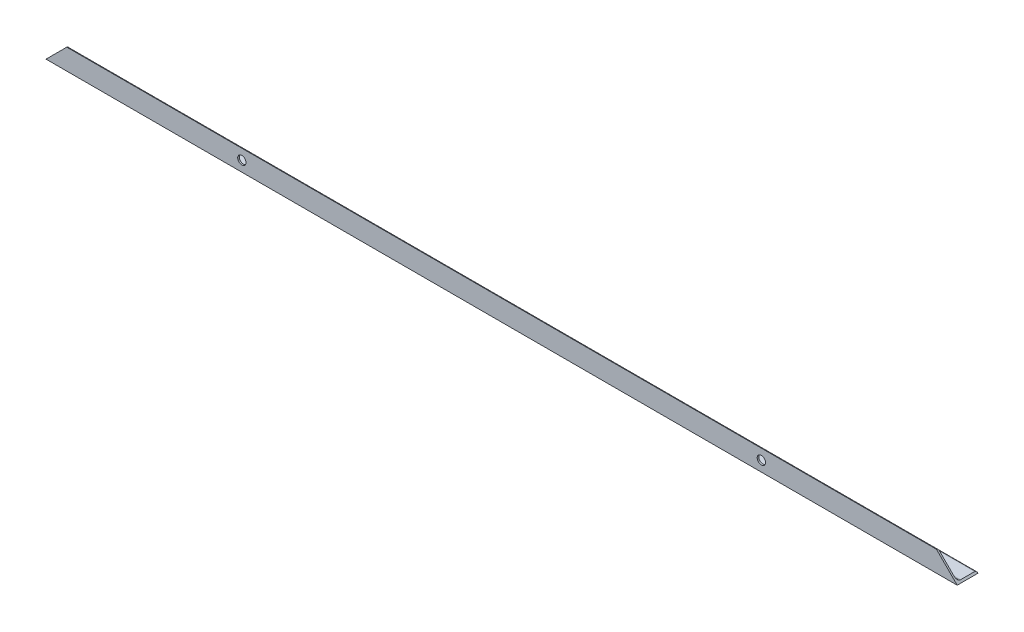
ISO-10303-21;
HEADER;
FILE_DESCRIPTION(('STEP AP214'),'2;1');
FILE_NAME('part.step','',(''),(''),'','','');
FILE_SCHEMA(('AUTOMOTIVE_DESIGN { 1 0 10303 214 1 1 1 1 }'));
ENDSEC;
DATA;
#1=APPLICATION_CONTEXT('core data for automotive mechanical design processes');
#2=APPLICATION_PROTOCOL_DEFINITION('international standard','automotive_design',2000,#1);
#3=PRODUCT_CONTEXT('',#1,'mechanical');
#4=PRODUCT('Part','Part','',(#3));
#5=PRODUCT_RELATED_PRODUCT_CATEGORY('part','',(#4));
#6=PRODUCT_DEFINITION_FORMATION('','',#4);
#7=PRODUCT_DEFINITION_CONTEXT('part definition',#1,'design');
#8=PRODUCT_DEFINITION('design','',#6,#7);
#9=PRODUCT_DEFINITION_SHAPE('','',#8);
#10=(LENGTH_UNIT() NAMED_UNIT(*) SI_UNIT(.MILLI.,.METRE.));
#11=(NAMED_UNIT(*) PLANE_ANGLE_UNIT() SI_UNIT($,.RADIAN.));
#12=(NAMED_UNIT(*) SI_UNIT($,.STERADIAN.) SOLID_ANGLE_UNIT());
#13=UNCERTAINTY_MEASURE_WITH_UNIT(LENGTH_MEASURE(1.E-05),#10,'distance_accuracy_value','');
#14=(GEOMETRIC_REPRESENTATION_CONTEXT(3) GLOBAL_UNCERTAINTY_ASSIGNED_CONTEXT((#13)) GLOBAL_UNIT_ASSIGNED_CONTEXT((#10,
#11,#12)) REPRESENTATION_CONTEXT('',''));
#15=CARTESIAN_POINT('',(0.,0.,0.));
#16=DIRECTION('',(0.,0.,1.));
#17=DIRECTION('',(1.,0.,0.));
#18=AXIS2_PLACEMENT_3D('',#15,#16,#17);
#19=CARTESIAN_POINT('',(1754.,0.,-40.));
#20=DIRECTION('',(0.,1.,0.));
#21=DIRECTION('',(0.,0.,1.));
#22=AXIS2_PLACEMENT_3D('',#19,#20,#21);
#23=PLANE('',#22);
#24=DIRECTION('',(0.,0.,-1.));
#25=VECTOR('',#24,1.);
#26=CARTESIAN_POINT('',(0.,0.,-40.));
#27=LINE('',#26,#25);
#28=CARTESIAN_POINT('',(0.,0.,0.));
#29=VERTEX_POINT('',#28);
#30=CARTESIAN_POINT('',(0.,0.,-40.));
#31=VERTEX_POINT('',#30);
#32=EDGE_CURVE('E113',#29,#31,#27,.T.);
#33=ORIENTED_EDGE('',*,*,#32,.T.);
#34=DIRECTION('',(-1.,0.,0.));
#35=VECTOR('',#34,1.);
#36=CARTESIAN_POINT('',(1754.,0.,-40.));
#37=LINE('',#36,#35);
#38=CARTESIAN_POINT('',(1754.,0.,-40.));
#39=VERTEX_POINT('',#38);
#40=EDGE_CURVE('E13',#39,#31,#37,.T.);
#41=ORIENTED_EDGE('',*,*,#40,.F.);
#42=DIRECTION('',(0.,0.,-1.));
#43=VECTOR('',#42,1.);
#44=CARTESIAN_POINT('',(1754.,0.,-40.));
#45=LINE('',#44,#43);
#46=CARTESIAN_POINT('',(1754.,0.,0.));
#47=VERTEX_POINT('',#46);
#48=EDGE_CURVE('E123',#47,#39,#45,.T.);
#49=ORIENTED_EDGE('',*,*,#48,.F.);
#50=DIRECTION('',(-1.,0.,0.));
#51=VECTOR('',#50,1.);
#52=CARTESIAN_POINT('',(1754.,0.,0.));
#53=LINE('',#52,#51);
#54=EDGE_CURVE('E129',#47,#29,#53,.T.);
#55=ORIENTED_EDGE('',*,*,#54,.T.);
#56=EDGE_LOOP('',(#33,#41,#49,#55));
#57=FACE_BOUND('',#56,.T.);
#58=ADVANCED_FACE('F60',(#57),#23,.F.);
#59=CARTESIAN_POINT('',(1754.,0.,-37.));
#60=DIRECTION('',(-1.,0.,0.));
#61=DIRECTION('',(0.,0.,1.));
#62=AXIS2_PLACEMENT_3D('',#59,#60,#61);
#63=CYLINDRICAL_SURFACE('',#62,3.);
#64=ORIENTED_EDGE('',*,*,#40,.T.);
#65=CARTESIAN_POINT('',(2.22044604925031E-13,0.,-37.));
#66=DIRECTION('',(0.707106781186548,-0.707106781186548,0.));
#67=DIRECTION('',(-0.707106781186548,-0.707106781186548,0.));
#68=AXIS2_PLACEMENT_3D('',#65,#66,#67);
#69=ELLIPSE('',#68,4.24264068711928,3.);
#70=CARTESIAN_POINT('',(3.00000000000011,3.,-37.));
#71=VERTEX_POINT('',#70);
#72=EDGE_CURVE('E119',#31,#71,#69,.T.);
#73=ORIENTED_EDGE('',*,*,#72,.T.);
#74=DIRECTION('',(-1.,0.,0.));
#75=VECTOR('',#74,1.);
#76=CARTESIAN_POINT('',(1754.,3.,-37.));
#77=LINE('',#76,#75);
#78=CARTESIAN_POINT('',(1751.,3.,-37.));
#79=VERTEX_POINT('',#78);
#80=EDGE_CURVE('E68',#79,#71,#77,.T.);
#81=ORIENTED_EDGE('',*,*,#80,.F.);
#82=CARTESIAN_POINT('',(1754.,0.,-37.));
#83=DIRECTION('',(-0.707106781186544,-0.707106781186551,0.));
#84=DIRECTION('',(-0.707106781186551,0.707106781186544,0.));
#85=AXIS2_PLACEMENT_3D('',#82,#83,#84);
#86=ELLIPSE('',#85,4.2426406871193,3.);
#87=EDGE_CURVE('E159',#79,#39,#86,.T.);
#88=ORIENTED_EDGE('',*,*,#87,.T.);
#89=EDGE_LOOP('',(#64,#73,#81,#88));
#90=FACE_BOUND('',#89,.T.);
#91=ADVANCED_FACE('F158',(#90),#63,.T.);
#92=CARTESIAN_POINT('',(1754.,3.,-9.));
#93=DIRECTION('',(0.,-1.,0.));
#94=DIRECTION('',(0.,0.,-1.));
#95=AXIS2_PLACEMENT_3D('',#92,#93,#94);
#96=PLANE('',#95);
#97=ORIENTED_EDGE('',*,*,#80,.T.);
#98=DIRECTION('',(0.,0.,1.));
#99=VECTOR('',#98,1.);
#100=CARTESIAN_POINT('',(3.00000000000011,3.,-9.));
#101=LINE('',#100,#99);
#102=CARTESIAN_POINT('',(3.00000000000034,3.,-9.00000000000001));
#103=VERTEX_POINT('',#102);
#104=EDGE_CURVE('E154',#71,#103,#101,.T.);
#105=ORIENTED_EDGE('',*,*,#104,.T.);
#106=DIRECTION('',(-1.,0.,0.));
#107=VECTOR('',#106,1.);
#108=CARTESIAN_POINT('',(1754.,3.,-9.00000000000001));
#109=LINE('',#108,#107);
#110=CARTESIAN_POINT('',(1751.,3.,-9.00000000000001));
#111=VERTEX_POINT('',#110);
#112=EDGE_CURVE('E145',#111,#103,#109,.T.);
#113=ORIENTED_EDGE('',*,*,#112,.F.);
#114=DIRECTION('',(0.,0.,-1.));
#115=VECTOR('',#114,1.);
#116=CARTESIAN_POINT('',(1751.,3.,-9.));
#117=LINE('',#116,#115);
#118=EDGE_CURVE('E155',#111,#79,#117,.T.);
#119=ORIENTED_EDGE('',*,*,#118,.T.);
#120=EDGE_LOOP('',(#97,#105,#113,#119));
#121=FACE_BOUND('',#120,.T.);
#122=ADVANCED_FACE('F152',(#121),#96,.F.);
#123=CARTESIAN_POINT('',(1754.,9.,-9.));
#124=DIRECTION('',(-1.,0.,0.));
#125=DIRECTION('',(0.,0.,1.));
#126=AXIS2_PLACEMENT_3D('',#123,#124,#125);
#127=CYLINDRICAL_SURFACE('',#126,6.);
#128=ORIENTED_EDGE('',*,*,#112,.T.);
#129=CARTESIAN_POINT('',(9.00000000000034,9.,-9.));
#130=DIRECTION('',(0.707106781186548,-0.707106781186548,0.));
#131=DIRECTION('',(-0.707106781186548,-0.707106781186548,0.));
#132=AXIS2_PLACEMENT_3D('',#129,#130,#131);
#133=ELLIPSE('',#132,8.48528137423857,6.);
#134=CARTESIAN_POINT('',(9.00000000000012,9.00000000000001,-3.));
#135=VERTEX_POINT('',#134);
#136=EDGE_CURVE('E165',#103,#135,#133,.F.);
#137=ORIENTED_EDGE('',*,*,#136,.T.);
#138=DIRECTION('',(-1.,0.,0.));
#139=VECTOR('',#138,1.);
#140=CARTESIAN_POINT('',(1754.,9.,-3.));
#141=LINE('',#140,#139);
#142=CARTESIAN_POINT('',(1745.,9.,-3.));
#143=VERTEX_POINT('',#142);
#144=EDGE_CURVE('E142',#143,#135,#141,.T.);
#145=ORIENTED_EDGE('',*,*,#144,.F.);
#146=CARTESIAN_POINT('',(1745.,9.,-9.));
#147=DIRECTION('',(-0.707106781186544,-0.707106781186551,0.));
#148=DIRECTION('',(-0.707106781186551,0.707106781186544,0.));
#149=AXIS2_PLACEMENT_3D('',#146,#147,#148);
#150=ELLIPSE('',#149,8.48528137423861,6.);
#151=EDGE_CURVE('E171',#143,#111,#150,.F.);
#152=ORIENTED_EDGE('',*,*,#151,.T.);
#153=EDGE_LOOP('',(#128,#137,#145,#152));
#154=FACE_BOUND('',#153,.T.);
#155=ADVANCED_FACE('F206',(#154),#127,.F.);
#156=CARTESIAN_POINT('',(1754.,37.,-3.));
#157=DIRECTION('',(0.,0.,1.));
#158=DIRECTION('',(1.,0.,0.));
#159=AXIS2_PLACEMENT_3D('',#156,#157,#158);
#160=PLANE('',#159);
#161=CARTESIAN_POINT('',(1377.,19.9999999999999,-3.));
#162=DIRECTION('',(0.,0.,1.));
#163=DIRECTION('',(1.,0.,0.));
#164=AXIS2_PLACEMENT_3D('',#161,#162,#163);
#165=CIRCLE('',#164,7.99999999999998);
#166=CARTESIAN_POINT('',(1385.,19.9999999999999,-3.));
#167=VERTEX_POINT('',#166);
#168=EDGE_CURVE('E124',#167,#167,#165,.T.);
#169=ORIENTED_EDGE('',*,*,#168,.T.);
#170=EDGE_LOOP('',(#169));
#171=FACE_BOUND('',#170,.T.);
#172=CARTESIAN_POINT('',(377.,19.9999999999997,-3.));
#173=DIRECTION('',(0.,0.,1.));
#174=DIRECTION('',(1.,0.,0.));
#175=AXIS2_PLACEMENT_3D('',#172,#173,#174);
#176=CIRCLE('',#175,7.99999999999998);
#177=CARTESIAN_POINT('',(385.,19.9999999999997,-3.));
#178=VERTEX_POINT('',#177);
#179=EDGE_CURVE('E176',#178,#178,#176,.T.);
#180=ORIENTED_EDGE('',*,*,#179,.T.);
#181=EDGE_LOOP('',(#180));
#182=FACE_BOUND('',#181,.T.);
#183=ORIENTED_EDGE('',*,*,#144,.T.);
#184=DIRECTION('',(0.707106781186548,0.707106781186548,0.));
#185=VECTOR('',#184,1.);
#186=CARTESIAN_POINT('',(895.5,895.5,-3.));
#187=LINE('',#186,#185);
#188=CARTESIAN_POINT('',(37.0000000000001,37.,-3.));
#189=VERTEX_POINT('',#188);
#190=EDGE_CURVE('E229',#135,#189,#187,.T.);
#191=ORIENTED_EDGE('',*,*,#190,.T.);
#192=DIRECTION('',(-1.,0.,0.));
#193=VECTOR('',#192,1.);
#194=CARTESIAN_POINT('',(1754.,37.,-3.));
#195=LINE('',#194,#193);
#196=CARTESIAN_POINT('',(1717.,37.,-3.));
#197=VERTEX_POINT('',#196);
#198=EDGE_CURVE('E136',#197,#189,#195,.T.);
#199=ORIENTED_EDGE('',*,*,#198,.F.);
#200=DIRECTION('',(0.707106781186551,-0.707106781186544,0.));
#201=VECTOR('',#200,1.);
#202=CARTESIAN_POINT('',(1735.5,18.4999999999998,-3.));
#203=LINE('',#202,#201);
#204=EDGE_CURVE('E163',#197,#143,#203,.T.);
#205=ORIENTED_EDGE('',*,*,#204,.T.);
#206=EDGE_LOOP('',(#183,#191,#199,#205));
#207=FACE_BOUND('',#206,.T.);
#208=ADVANCED_FACE('F182',(#171,#182,#207),#160,.F.);
#209=CARTESIAN_POINT('',(1754.,37.,0.));
#210=DIRECTION('',(-1.,0.,0.));
#211=DIRECTION('',(0.,0.,1.));
#212=AXIS2_PLACEMENT_3D('',#209,#210,#211);
#213=CYLINDRICAL_SURFACE('',#212,3.);
#214=ORIENTED_EDGE('',*,*,#198,.T.);
#215=CARTESIAN_POINT('',(37.0000000000001,37.,0.));
#216=DIRECTION('',(0.707106781186548,-0.707106781186548,0.));
#217=DIRECTION('',(-0.707106781186548,-0.707106781186548,0.));
#218=AXIS2_PLACEMENT_3D('',#215,#216,#217);
#219=ELLIPSE('',#218,4.24264068711929,3.);
#220=CARTESIAN_POINT('',(40.,40.,0.));
#221=VERTEX_POINT('',#220);
#222=EDGE_CURVE('E133',#189,#221,#219,.T.);
#223=ORIENTED_EDGE('',*,*,#222,.T.);
#224=DIRECTION('',(-1.,0.,0.));
#225=VECTOR('',#224,1.);
#226=CARTESIAN_POINT('',(1754.,40.,0.));
#227=LINE('',#226,#225);
#228=CARTESIAN_POINT('',(1714.,39.9999999999997,0.));
#229=VERTEX_POINT('',#228);
#230=EDGE_CURVE('E132',#229,#221,#227,.T.);
#231=ORIENTED_EDGE('',*,*,#230,.F.);
#232=CARTESIAN_POINT('',(1717.,37.,0.));
#233=DIRECTION('',(-0.707106781186544,-0.707106781186551,0.));
#234=DIRECTION('',(-0.707106781186551,0.707106781186544,0.));
#235=AXIS2_PLACEMENT_3D('',#232,#233,#234);
#236=ELLIPSE('',#235,4.24264068711931,3.);
#237=EDGE_CURVE('E160',#229,#197,#236,.T.);
#238=ORIENTED_EDGE('',*,*,#237,.T.);
#239=EDGE_LOOP('',(#214,#223,#231,#238));
#240=FACE_BOUND('',#239,.T.);
#241=ADVANCED_FACE('F214',(#240),#213,.T.);
#242=CARTESIAN_POINT('',(1754.,40.,0.));
#243=DIRECTION('',(0.,0.,-1.));
#244=DIRECTION('',(-1.,0.,0.));
#245=AXIS2_PLACEMENT_3D('',#242,#243,#244);
#246=PLANE('',#245);
#247=CARTESIAN_POINT('',(1377.,19.9999999999999,0.));
#248=DIRECTION('',(0.,0.,1.));
#249=DIRECTION('',(1.,0.,0.));
#250=AXIS2_PLACEMENT_3D('',#247,#248,#249);
#251=CIRCLE('',#250,7.99999999999998);
#252=CARTESIAN_POINT('',(1385.,19.9999999999999,0.));
#253=VERTEX_POINT('',#252);
#254=EDGE_CURVE('E236',#253,#253,#251,.T.);
#255=ORIENTED_EDGE('',*,*,#254,.F.);
#256=EDGE_LOOP('',(#255));
#257=FACE_BOUND('',#256,.T.);
#258=CARTESIAN_POINT('',(377.,19.9999999999997,0.));
#259=DIRECTION('',(0.,0.,1.));
#260=DIRECTION('',(1.,0.,0.));
#261=AXIS2_PLACEMENT_3D('',#258,#259,#260);
#262=CIRCLE('',#261,7.99999999999998);
#263=CARTESIAN_POINT('',(385.,19.9999999999997,0.));
#264=VERTEX_POINT('',#263);
#265=EDGE_CURVE('E233',#264,#264,#262,.T.);
#266=ORIENTED_EDGE('',*,*,#265,.F.);
#267=EDGE_LOOP('',(#266));
#268=FACE_BOUND('',#267,.T.);
#269=ORIENTED_EDGE('',*,*,#230,.T.);
#270=DIRECTION('',(0.707106781186548,0.707106781186548,0.));
#271=VECTOR('',#270,1.);
#272=CARTESIAN_POINT('',(40.,40.,0.));
#273=LINE('',#272,#271);
#274=EDGE_CURVE('E116',#29,#221,#273,.T.);
#275=ORIENTED_EDGE('',*,*,#274,.F.);
#276=ORIENTED_EDGE('',*,*,#54,.F.);
#277=DIRECTION('',(0.707106781186551,-0.707106781186544,0.));
#278=VECTOR('',#277,1.);
#279=CARTESIAN_POINT('',(1714.,39.9999999999997,0.));
#280=LINE('',#279,#278);
#281=EDGE_CURVE('E74',#229,#47,#280,.T.);
#282=ORIENTED_EDGE('',*,*,#281,.F.);
#283=EDGE_LOOP('',(#269,#275,#276,#282));
#284=FACE_BOUND('',#283,.T.);
#285=ADVANCED_FACE('F128',(#257,#268,#284),#246,.F.);
#286=CARTESIAN_POINT('',(40.,40.,-40.));
#287=DIRECTION('',(0.707106781186548,-0.707106781186548,0.));
#288=DIRECTION('',(0.707106781186548,0.707106781186548,0.));
#289=AXIS2_PLACEMENT_3D('',#286,#287,#288);
#290=PLANE('',#289);
#291=ORIENTED_EDGE('',*,*,#32,.F.);
#292=ORIENTED_EDGE('',*,*,#274,.T.);
#293=ORIENTED_EDGE('',*,*,#222,.F.);
#294=ORIENTED_EDGE('',*,*,#190,.F.);
#295=ORIENTED_EDGE('',*,*,#136,.F.);
#296=ORIENTED_EDGE('',*,*,#104,.F.);
#297=ORIENTED_EDGE('',*,*,#72,.F.);
#298=EDGE_LOOP('',(#291,#292,#293,#294,#295,#296,#297));
#299=FACE_BOUND('',#298,.T.);
#300=ADVANCED_FACE('F115',(#299),#290,.F.);
#301=CARTESIAN_POINT('',(1714.,39.9999999999997,-40.));
#302=DIRECTION('',(-0.707106781186544,-0.707106781186551,0.));
#303=DIRECTION('',(0.707106781186551,-0.707106781186544,0.));
#304=AXIS2_PLACEMENT_3D('',#301,#302,#303);
#305=PLANE('',#304);
#306=ORIENTED_EDGE('',*,*,#118,.F.);
#307=ORIENTED_EDGE('',*,*,#151,.F.);
#308=ORIENTED_EDGE('',*,*,#204,.F.);
#309=ORIENTED_EDGE('',*,*,#237,.F.);
#310=ORIENTED_EDGE('',*,*,#281,.T.);
#311=ORIENTED_EDGE('',*,*,#48,.T.);
#312=ORIENTED_EDGE('',*,*,#87,.F.);
#313=EDGE_LOOP('',(#306,#307,#308,#309,#310,#311,#312));
#314=FACE_BOUND('',#313,.T.);
#315=ADVANCED_FACE('F193',(#314),#305,.F.);
#316=CARTESIAN_POINT('',(377.,19.9999999999997,-40.));
#317=DIRECTION('',(0.,0.,1.));
#318=DIRECTION('',(1.,0.,0.));
#319=AXIS2_PLACEMENT_3D('',#316,#317,#318);
#320=CYLINDRICAL_SURFACE('',#319,7.99999999999998);
#321=ORIENTED_EDGE('',*,*,#265,.T.);
#322=EDGE_LOOP('',(#321));
#323=FACE_BOUND('',#322,.T.);
#324=ORIENTED_EDGE('',*,*,#179,.F.);
#325=EDGE_LOOP('',(#324));
#326=FACE_BOUND('',#325,.T.);
#327=ADVANCED_FACE('F187',(#323,#326),#320,.F.);
#328=CARTESIAN_POINT('',(1377.,19.9999999999999,-40.));
#329=DIRECTION('',(0.,0.,1.));
#330=DIRECTION('',(1.,0.,0.));
#331=AXIS2_PLACEMENT_3D('',#328,#329,#330);
#332=CYLINDRICAL_SURFACE('',#331,7.99999999999998);
#333=ORIENTED_EDGE('',*,*,#254,.T.);
#334=EDGE_LOOP('',(#333));
#335=FACE_BOUND('',#334,.T.);
#336=ORIENTED_EDGE('',*,*,#168,.F.);
#337=EDGE_LOOP('',(#336));
#338=FACE_BOUND('',#337,.T.);
#339=ADVANCED_FACE('F185',(#335,#338),#332,.F.);
#340=CLOSED_SHELL('',(#58,#91,#122,#155,#208,#241,#285,#300,#315,#327,#339));
#341=MANIFOLD_SOLID_BREP('B2',#340);
#342=ADVANCED_BREP_SHAPE_REPRESENTATION('',(#18,#341),#14);
#343=SHAPE_DEFINITION_REPRESENTATION(#9,#342);
ENDSEC;
END-ISO-10303-21;
